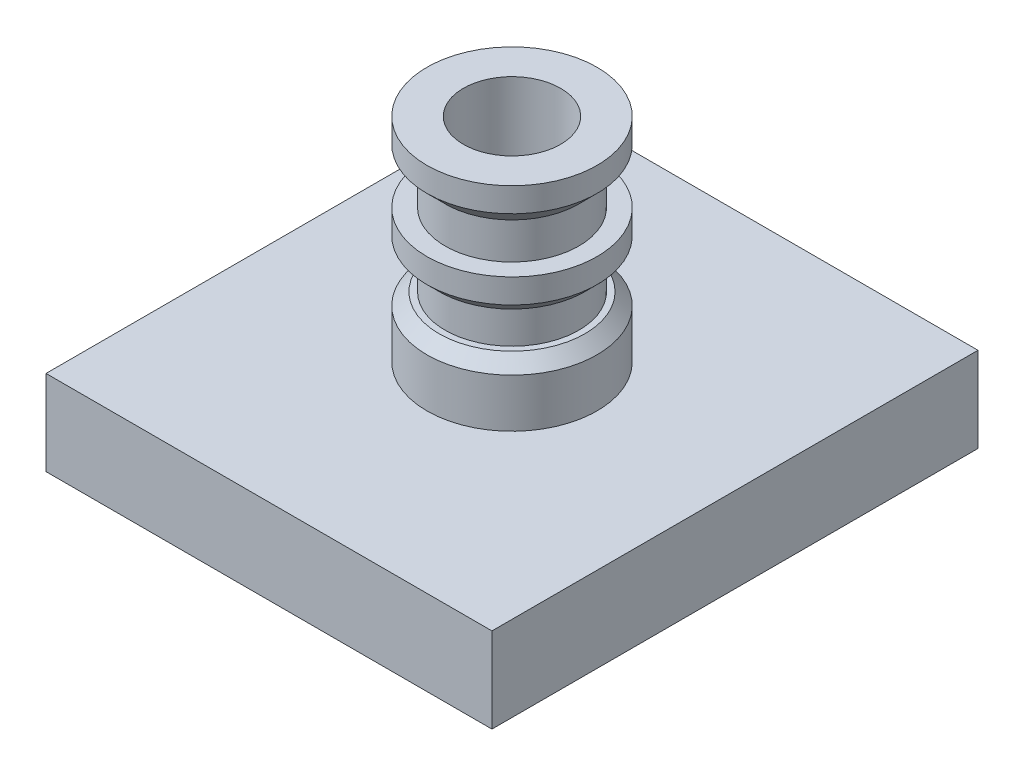
ISO-10303-21;
HEADER;
FILE_DESCRIPTION(('STEP AP214'),'2;1');
FILE_NAME('part.step','',(''),(''),'','','');
FILE_SCHEMA(('AUTOMOTIVE_DESIGN { 1 0 10303 214 1 1 1 1 }'));
ENDSEC;
DATA;
#1=APPLICATION_CONTEXT('core data for automotive mechanical design processes');
#2=APPLICATION_PROTOCOL_DEFINITION('international standard','automotive_design',2000,#1);
#3=PRODUCT_CONTEXT('',#1,'mechanical');
#4=PRODUCT('Part','Part','',(#3));
#5=PRODUCT_RELATED_PRODUCT_CATEGORY('part','',(#4));
#6=PRODUCT_DEFINITION_FORMATION('','',#4);
#7=PRODUCT_DEFINITION_CONTEXT('part definition',#1,'design');
#8=PRODUCT_DEFINITION('design','',#6,#7);
#9=PRODUCT_DEFINITION_SHAPE('','',#8);
#10=(LENGTH_UNIT() NAMED_UNIT(*) SI_UNIT(.MILLI.,.METRE.));
#11=(NAMED_UNIT(*) PLANE_ANGLE_UNIT() SI_UNIT($,.RADIAN.));
#12=(NAMED_UNIT(*) SI_UNIT($,.STERADIAN.) SOLID_ANGLE_UNIT());
#13=UNCERTAINTY_MEASURE_WITH_UNIT(LENGTH_MEASURE(1.E-05),#10,'distance_accuracy_value','');
#14=(GEOMETRIC_REPRESENTATION_CONTEXT(3) GLOBAL_UNCERTAINTY_ASSIGNED_CONTEXT((#13)) GLOBAL_UNIT_ASSIGNED_CONTEXT((#10,
#11,#12)) REPRESENTATION_CONTEXT('',''));
#15=CARTESIAN_POINT('',(0.,0.,0.));
#16=DIRECTION('',(0.,0.,1.));
#17=DIRECTION('',(1.,0.,0.));
#18=AXIS2_PLACEMENT_3D('',#15,#16,#17);
#19=CARTESIAN_POINT('',(0.,7.,0.));
#20=DIRECTION('',(0.,-1.,0.));
#21=DIRECTION('',(0.,0.,-1.));
#22=AXIS2_PLACEMENT_3D('',#19,#20,#21);
#23=CYLINDRICAL_SURFACE('',#22,4.);
#24=CARTESIAN_POINT('',(0.,24.5,0.));
#25=DIRECTION('',(0.,-1.,0.));
#26=DIRECTION('',(0.,0.,-1.));
#27=AXIS2_PLACEMENT_3D('',#24,#25,#26);
#28=CIRCLE('',#27,4.);
#29=CARTESIAN_POINT('',(0.,24.5,-4.));
#30=VERTEX_POINT('',#29);
#31=EDGE_CURVE('E202',#30,#30,#28,.T.);
#32=ORIENTED_EDGE('',*,*,#31,.F.);
#33=EDGE_LOOP('',(#32));
#34=FACE_BOUND('',#33,.T.);
#35=CARTESIAN_POINT('',(0.,2.,0.));
#36=DIRECTION('',(0.,-1.,0.));
#37=DIRECTION('',(0.,0.,-1.));
#38=AXIS2_PLACEMENT_3D('',#35,#36,#37);
#39=CIRCLE('',#38,4.);
#40=CARTESIAN_POINT('',(0.,2.,-4.));
#41=VERTEX_POINT('',#40);
#42=EDGE_CURVE('E40',#41,#41,#39,.T.);
#43=ORIENTED_EDGE('',*,*,#42,.T.);
#44=EDGE_LOOP('',(#43));
#45=FACE_BOUND('',#44,.T.);
#46=ADVANCED_FACE('F35',(#34,#45),#23,.F.);
#47=CARTESIAN_POINT('',(0.,7.,0.));
#48=DIRECTION('',(0.,-1.,0.));
#49=DIRECTION('',(0.,0.,-1.));
#50=AXIS2_PLACEMENT_3D('',#47,#48,#49);
#51=PLANE('',#50);
#52=CARTESIAN_POINT('',(0.,7.,0.));
#53=DIRECTION('',(0.,-1.,0.));
#54=DIRECTION('',(0.,0.,-1.));
#55=AXIS2_PLACEMENT_3D('',#52,#53,#54);
#56=CIRCLE('',#55,7.);
#57=CARTESIAN_POINT('',(0.,7.,-7.));
#58=VERTEX_POINT('',#57);
#59=EDGE_CURVE('E108',#58,#58,#56,.T.);
#60=ORIENTED_EDGE('',*,*,#59,.T.);
#61=EDGE_LOOP('',(#60));
#62=FACE_BOUND('',#61,.T.);
#63=DIRECTION('',(0.,0.,-1.));
#64=VECTOR('',#63,1.);
#65=CARTESIAN_POINT('',(18.35,7.,20.));
#66=LINE('',#65,#64);
#67=CARTESIAN_POINT('',(18.35,7.,20.));
#68=VERTEX_POINT('',#67);
#69=CARTESIAN_POINT('',(18.35,7.,-20.));
#70=VERTEX_POINT('',#69);
#71=EDGE_CURVE('E90',#68,#70,#66,.T.);
#72=ORIENTED_EDGE('',*,*,#71,.T.);
#73=DIRECTION('',(-1.,0.,0.));
#74=VECTOR('',#73,1.);
#75=CARTESIAN_POINT('',(-18.35,7.,-20.));
#76=LINE('',#75,#74);
#77=CARTESIAN_POINT('',(-18.35,7.,-20.));
#78=VERTEX_POINT('',#77);
#79=EDGE_CURVE('E85',#70,#78,#76,.T.);
#80=ORIENTED_EDGE('',*,*,#79,.T.);
#81=DIRECTION('',(0.,0.,1.));
#82=VECTOR('',#81,1.);
#83=CARTESIAN_POINT('',(-18.35,7.,20.));
#84=LINE('',#83,#82);
#85=CARTESIAN_POINT('',(-18.35,7.,20.));
#86=VERTEX_POINT('',#85);
#87=EDGE_CURVE('E88',#78,#86,#84,.T.);
#88=ORIENTED_EDGE('',*,*,#87,.T.);
#89=DIRECTION('',(1.,0.,0.));
#90=VECTOR('',#89,1.);
#91=CARTESIAN_POINT('',(-18.35,7.,20.));
#92=LINE('',#91,#90);
#93=EDGE_CURVE('E54',#86,#68,#92,.T.);
#94=ORIENTED_EDGE('',*,*,#93,.T.);
#95=EDGE_LOOP('',(#72,#80,#88,#94));
#96=FACE_BOUND('',#95,.T.);
#97=ADVANCED_FACE('F86',(#62,#96),#51,.F.);
#98=CARTESIAN_POINT('',(0.,0.,0.));
#99=DIRECTION('',(0.,-1.,0.));
#100=DIRECTION('',(0.,0.,-1.));
#101=AXIS2_PLACEMENT_3D('',#98,#99,#100);
#102=PLANE('',#101);
#103=CARTESIAN_POINT('',(0.,0.,0.));
#104=DIRECTION('',(0.,-1.,0.));
#105=DIRECTION('',(0.,0.,-1.));
#106=AXIS2_PLACEMENT_3D('',#103,#104,#105);
#107=CIRCLE('',#106,6.55);
#108=CARTESIAN_POINT('',(0.,0.,-6.55));
#109=VERTEX_POINT('',#108);
#110=EDGE_CURVE('E205',#109,#109,#107,.T.);
#111=ORIENTED_EDGE('',*,*,#110,.F.);
#112=EDGE_LOOP('',(#111));
#113=FACE_BOUND('',#112,.T.);
#114=DIRECTION('',(0.,0.,-1.));
#115=VECTOR('',#114,1.);
#116=CARTESIAN_POINT('',(18.35,0.,20.));
#117=LINE('',#116,#115);
#118=CARTESIAN_POINT('',(18.35,0.,20.));
#119=VERTEX_POINT('',#118);
#120=CARTESIAN_POINT('',(18.35,0.,-20.));
#121=VERTEX_POINT('',#120);
#122=EDGE_CURVE('E105',#119,#121,#117,.T.);
#123=ORIENTED_EDGE('',*,*,#122,.F.);
#124=DIRECTION('',(1.,0.,0.));
#125=VECTOR('',#124,1.);
#126=CARTESIAN_POINT('',(-18.35,0.,20.));
#127=LINE('',#126,#125);
#128=CARTESIAN_POINT('',(-18.35,0.,20.));
#129=VERTEX_POINT('',#128);
#130=EDGE_CURVE('E77',#129,#119,#127,.T.);
#131=ORIENTED_EDGE('',*,*,#130,.F.);
#132=DIRECTION('',(0.,0.,1.));
#133=VECTOR('',#132,1.);
#134=CARTESIAN_POINT('',(-18.35,0.,20.));
#135=LINE('',#134,#133);
#136=CARTESIAN_POINT('',(-18.35,0.,-20.));
#137=VERTEX_POINT('',#136);
#138=EDGE_CURVE('E71',#137,#129,#135,.T.);
#139=ORIENTED_EDGE('',*,*,#138,.F.);
#140=DIRECTION('',(-1.,0.,0.));
#141=VECTOR('',#140,1.);
#142=CARTESIAN_POINT('',(-18.35,0.,-20.));
#143=LINE('',#142,#141);
#144=EDGE_CURVE('E95',#121,#137,#143,.T.);
#145=ORIENTED_EDGE('',*,*,#144,.F.);
#146=EDGE_LOOP('',(#123,#131,#139,#145));
#147=FACE_BOUND('',#146,.T.);
#148=ADVANCED_FACE('F147',(#113,#147),#102,.T.);
#149=CARTESIAN_POINT('',(18.35,7.,20.));
#150=DIRECTION('',(-1.,0.,0.));
#151=DIRECTION('',(0.,0.,1.));
#152=AXIS2_PLACEMENT_3D('',#149,#150,#151);
#153=PLANE('',#152);
#154=ORIENTED_EDGE('',*,*,#122,.T.);
#155=DIRECTION('',(0.,-1.,0.));
#156=VECTOR('',#155,1.);
#157=CARTESIAN_POINT('',(18.35,7.,-20.));
#158=LINE('',#157,#156);
#159=EDGE_CURVE('E96',#70,#121,#158,.T.);
#160=ORIENTED_EDGE('',*,*,#159,.F.);
#161=ORIENTED_EDGE('',*,*,#71,.F.);
#162=DIRECTION('',(0.,-1.,0.));
#163=VECTOR('',#162,1.);
#164=CARTESIAN_POINT('',(18.35,7.,20.));
#165=LINE('',#164,#163);
#166=EDGE_CURVE('E101',#68,#119,#165,.T.);
#167=ORIENTED_EDGE('',*,*,#166,.T.);
#168=EDGE_LOOP('',(#154,#160,#161,#167));
#169=FACE_BOUND('',#168,.T.);
#170=ADVANCED_FACE('F158',(#169),#153,.F.);
#171=CARTESIAN_POINT('',(-18.35,7.,-20.));
#172=DIRECTION('',(0.,0.,1.));
#173=DIRECTION('',(1.,0.,0.));
#174=AXIS2_PLACEMENT_3D('',#171,#172,#173);
#175=PLANE('',#174);
#176=ORIENTED_EDGE('',*,*,#144,.T.);
#177=DIRECTION('',(0.,-1.,0.));
#178=VECTOR('',#177,1.);
#179=CARTESIAN_POINT('',(-18.35,7.,-20.));
#180=LINE('',#179,#178);
#181=EDGE_CURVE('E93',#78,#137,#180,.T.);
#182=ORIENTED_EDGE('',*,*,#181,.F.);
#183=ORIENTED_EDGE('',*,*,#79,.F.);
#184=ORIENTED_EDGE('',*,*,#159,.T.);
#185=EDGE_LOOP('',(#176,#182,#183,#184));
#186=FACE_BOUND('',#185,.T.);
#187=ADVANCED_FACE('F94',(#186),#175,.F.);
#188=CARTESIAN_POINT('',(-18.35,7.,20.));
#189=DIRECTION('',(1.,0.,0.));
#190=DIRECTION('',(0.,0.,-1.));
#191=AXIS2_PLACEMENT_3D('',#188,#189,#190);
#192=PLANE('',#191);
#193=ORIENTED_EDGE('',*,*,#138,.T.);
#194=DIRECTION('',(0.,-1.,0.));
#195=VECTOR('',#194,1.);
#196=CARTESIAN_POINT('',(-18.35,7.,20.));
#197=LINE('',#196,#195);
#198=EDGE_CURVE('E97',#86,#129,#197,.T.);
#199=ORIENTED_EDGE('',*,*,#198,.F.);
#200=ORIENTED_EDGE('',*,*,#87,.F.);
#201=ORIENTED_EDGE('',*,*,#181,.T.);
#202=EDGE_LOOP('',(#193,#199,#200,#201));
#203=FACE_BOUND('',#202,.T.);
#204=ADVANCED_FACE('F99',(#203),#192,.F.);
#205=CARTESIAN_POINT('',(-18.35,7.,20.));
#206=DIRECTION('',(0.,0.,-1.));
#207=DIRECTION('',(-1.,0.,0.));
#208=AXIS2_PLACEMENT_3D('',#205,#206,#207);
#209=PLANE('',#208);
#210=ORIENTED_EDGE('',*,*,#130,.T.);
#211=ORIENTED_EDGE('',*,*,#166,.F.);
#212=ORIENTED_EDGE('',*,*,#93,.F.);
#213=ORIENTED_EDGE('',*,*,#198,.T.);
#214=EDGE_LOOP('',(#210,#211,#212,#213));
#215=FACE_BOUND('',#214,.T.);
#216=ADVANCED_FACE('F160',(#215),#209,.F.);
#217=CARTESIAN_POINT('',(0.,7.,0.));
#218=DIRECTION('',(0.,-1.,0.));
#219=DIRECTION('',(0.,0.,-1.));
#220=AXIS2_PLACEMENT_3D('',#217,#218,#219);
#221=CYLINDRICAL_SURFACE('',#220,7.);
#222=CARTESIAN_POINT('',(0.,11.,0.));
#223=DIRECTION('',(0.,1.,0.));
#224=DIRECTION('',(0.,0.,1.));
#225=AXIS2_PLACEMENT_3D('',#222,#223,#224);
#226=CIRCLE('',#225,7.);
#227=CARTESIAN_POINT('',(0.,11.,7.));
#228=VERTEX_POINT('',#227);
#229=EDGE_CURVE('E115',#228,#228,#226,.F.);
#230=ORIENTED_EDGE('',*,*,#229,.T.);
#231=EDGE_LOOP('',(#230));
#232=FACE_BOUND('',#231,.T.);
#233=ORIENTED_EDGE('',*,*,#59,.F.);
#234=EDGE_LOOP('',(#233));
#235=FACE_BOUND('',#234,.T.);
#236=ADVANCED_FACE('F153',(#232,#235),#221,.T.);
#237=CARTESIAN_POINT('',(0.,12.,-7.));
#238=DIRECTION('',(0.,1.,0.));
#239=DIRECTION('',(0.,0.,1.));
#240=AXIS2_PLACEMENT_3D('',#237,#238,#239);
#241=PLANE('',#240);
#242=CARTESIAN_POINT('',(0.,12.,0.));
#243=DIRECTION('',(0.,1.,0.));
#244=DIRECTION('',(0.,0.,1.));
#245=AXIS2_PLACEMENT_3D('',#242,#243,#244);
#246=CIRCLE('',#245,5.99999999999998);
#247=CARTESIAN_POINT('',(0.,12.,5.99999999999998));
#248=VERTEX_POINT('',#247);
#249=EDGE_CURVE('E118',#248,#248,#246,.T.);
#250=ORIENTED_EDGE('',*,*,#249,.T.);
#251=EDGE_LOOP('',(#250));
#252=FACE_BOUND('',#251,.T.);
#253=CARTESIAN_POINT('',(0.,12.,0.));
#254=DIRECTION('',(0.,-1.,0.));
#255=DIRECTION('',(0.,0.,-1.));
#256=AXIS2_PLACEMENT_3D('',#253,#254,#255);
#257=CIRCLE('',#256,5.5);
#258=CARTESIAN_POINT('',(0.,12.,-5.5));
#259=VERTEX_POINT('',#258);
#260=EDGE_CURVE('E181',#259,#259,#257,.T.);
#261=ORIENTED_EDGE('',*,*,#260,.T.);
#262=EDGE_LOOP('',(#261));
#263=FACE_BOUND('',#262,.T.);
#264=ADVANCED_FACE('F247',(#252,#263),#241,.T.);
#265=CARTESIAN_POINT('',(0.,7.,0.));
#266=DIRECTION('',(0.,-1.,0.));
#267=DIRECTION('',(0.,0.,-1.));
#268=AXIS2_PLACEMENT_3D('',#265,#266,#267);
#269=CYLINDRICAL_SURFACE('',#268,5.5);
#270=CARTESIAN_POINT('',(0.,15.,0.));
#271=DIRECTION('',(0.,-1.,0.));
#272=DIRECTION('',(0.,0.,-1.));
#273=AXIS2_PLACEMENT_3D('',#270,#271,#272);
#274=CIRCLE('',#273,5.5);
#275=CARTESIAN_POINT('',(0.,15.,-5.5));
#276=VERTEX_POINT('',#275);
#277=EDGE_CURVE('E184',#276,#276,#274,.T.);
#278=ORIENTED_EDGE('',*,*,#277,.T.);
#279=EDGE_LOOP('',(#278));
#280=FACE_BOUND('',#279,.T.);
#281=ORIENTED_EDGE('',*,*,#260,.F.);
#282=EDGE_LOOP('',(#281));
#283=FACE_BOUND('',#282,.T.);
#284=ADVANCED_FACE('F245',(#280,#283),#269,.T.);
#285=CARTESIAN_POINT('',(0.,15.,-5.5));
#286=DIRECTION('',(0.,-1.,0.));
#287=DIRECTION('',(0.,0.,-1.));
#288=AXIS2_PLACEMENT_3D('',#285,#286,#287);
#289=PLANE('',#288);
#290=CARTESIAN_POINT('',(0.,15.,0.));
#291=DIRECTION('',(0.,-1.,0.));
#292=DIRECTION('',(0.,0.,-1.));
#293=AXIS2_PLACEMENT_3D('',#290,#291,#292);
#294=CIRCLE('',#293,6.00000000000001);
#295=CARTESIAN_POINT('',(0.,15.,-6.00000000000001));
#296=VERTEX_POINT('',#295);
#297=EDGE_CURVE('E46',#296,#296,#294,.T.);
#298=ORIENTED_EDGE('',*,*,#297,.T.);
#299=EDGE_LOOP('',(#298));
#300=FACE_BOUND('',#299,.T.);
#301=ORIENTED_EDGE('',*,*,#277,.F.);
#302=EDGE_LOOP('',(#301));
#303=FACE_BOUND('',#302,.T.);
#304=ADVANCED_FACE('F124',(#300,#303),#289,.T.);
#305=CARTESIAN_POINT('',(0.,7.,0.));
#306=DIRECTION('',(0.,-1.,0.));
#307=DIRECTION('',(0.,0.,-1.));
#308=AXIS2_PLACEMENT_3D('',#305,#306,#307);
#309=CYLINDRICAL_SURFACE('',#308,7.);
#310=CARTESIAN_POINT('',(0.,16.,0.));
#311=DIRECTION('',(0.,-1.,0.));
#312=DIRECTION('',(0.,0.,-1.));
#313=AXIS2_PLACEMENT_3D('',#310,#311,#312);
#314=CIRCLE('',#313,7.);
#315=CARTESIAN_POINT('',(0.,16.,-7.));
#316=VERTEX_POINT('',#315);
#317=EDGE_CURVE('E11',#316,#316,#314,.F.);
#318=ORIENTED_EDGE('',*,*,#317,.T.);
#319=EDGE_LOOP('',(#318));
#320=FACE_BOUND('',#319,.T.);
#321=CARTESIAN_POINT('',(0.,18.,0.));
#322=DIRECTION('',(0.,-1.,0.));
#323=DIRECTION('',(0.,0.,-1.));
#324=AXIS2_PLACEMENT_3D('',#321,#322,#323);
#325=CIRCLE('',#324,7.);
#326=CARTESIAN_POINT('',(0.,18.,-7.));
#327=VERTEX_POINT('',#326);
#328=EDGE_CURVE('E187',#327,#327,#325,.T.);
#329=ORIENTED_EDGE('',*,*,#328,.T.);
#330=EDGE_LOOP('',(#329));
#331=FACE_BOUND('',#330,.T.);
#332=ADVANCED_FACE('F238',(#320,#331),#309,.T.);
#333=CARTESIAN_POINT('',(0.,18.,-7.));
#334=DIRECTION('',(0.,1.,0.));
#335=DIRECTION('',(0.,0.,1.));
#336=AXIS2_PLACEMENT_3D('',#333,#334,#335);
#337=PLANE('',#336);
#338=CARTESIAN_POINT('',(0.,18.,0.));
#339=DIRECTION('',(0.,-1.,0.));
#340=DIRECTION('',(0.,0.,-1.));
#341=AXIS2_PLACEMENT_3D('',#338,#339,#340);
#342=CIRCLE('',#341,5.5);
#343=CARTESIAN_POINT('',(0.,18.,-5.5));
#344=VERTEX_POINT('',#343);
#345=EDGE_CURVE('E190',#344,#344,#342,.T.);
#346=ORIENTED_EDGE('',*,*,#345,.T.);
#347=EDGE_LOOP('',(#346));
#348=FACE_BOUND('',#347,.T.);
#349=ORIENTED_EDGE('',*,*,#328,.F.);
#350=EDGE_LOOP('',(#349));
#351=FACE_BOUND('',#350,.T.);
#352=ADVANCED_FACE('F234',(#348,#351),#337,.T.);
#353=CARTESIAN_POINT('',(0.,7.,0.));
#354=DIRECTION('',(0.,-1.,0.));
#355=DIRECTION('',(0.,0.,-1.));
#356=AXIS2_PLACEMENT_3D('',#353,#354,#355);
#357=CYLINDRICAL_SURFACE('',#356,5.5);
#358=CARTESIAN_POINT('',(0.,21.,0.));
#359=DIRECTION('',(0.,-1.,0.));
#360=DIRECTION('',(0.,0.,-1.));
#361=AXIS2_PLACEMENT_3D('',#358,#359,#360);
#362=CIRCLE('',#361,5.5);
#363=CARTESIAN_POINT('',(0.,21.,-5.5));
#364=VERTEX_POINT('',#363);
#365=EDGE_CURVE('E193',#364,#364,#362,.T.);
#366=ORIENTED_EDGE('',*,*,#365,.T.);
#367=EDGE_LOOP('',(#366));
#368=FACE_BOUND('',#367,.T.);
#369=ORIENTED_EDGE('',*,*,#345,.F.);
#370=EDGE_LOOP('',(#369));
#371=FACE_BOUND('',#370,.T.);
#372=ADVANCED_FACE('F230',(#368,#371),#357,.T.);
#373=CARTESIAN_POINT('',(0.,21.,0.));
#374=DIRECTION('',(0.,1.,0.));
#375=DIRECTION('',(0.,0.,1.));
#376=AXIS2_PLACEMENT_3D('',#373,#374,#375);
#377=CONICAL_SURFACE('',#376,5.5,0.785398163397447);
#378=CARTESIAN_POINT('',(0.,22.5,0.));
#379=DIRECTION('',(0.,-1.,0.));
#380=DIRECTION('',(0.,0.,-1.));
#381=AXIS2_PLACEMENT_3D('',#378,#379,#380);
#382=CIRCLE('',#381,7.);
#383=CARTESIAN_POINT('',(0.,22.5,-7.));
#384=VERTEX_POINT('',#383);
#385=EDGE_CURVE('E196',#384,#384,#382,.T.);
#386=ORIENTED_EDGE('',*,*,#385,.T.);
#387=EDGE_LOOP('',(#386));
#388=FACE_BOUND('',#387,.T.);
#389=ORIENTED_EDGE('',*,*,#365,.F.);
#390=EDGE_LOOP('',(#389));
#391=FACE_BOUND('',#390,.T.);
#392=ADVANCED_FACE('F226',(#388,#391),#377,.T.);
#393=CARTESIAN_POINT('',(0.,7.,0.));
#394=DIRECTION('',(0.,-1.,0.));
#395=DIRECTION('',(0.,0.,-1.));
#396=AXIS2_PLACEMENT_3D('',#393,#394,#395);
#397=CYLINDRICAL_SURFACE('',#396,7.);
#398=CARTESIAN_POINT('',(0.,24.5,0.));
#399=DIRECTION('',(0.,-1.,0.));
#400=DIRECTION('',(0.,0.,-1.));
#401=AXIS2_PLACEMENT_3D('',#398,#399,#400);
#402=CIRCLE('',#401,7.);
#403=CARTESIAN_POINT('',(0.,24.5,-7.));
#404=VERTEX_POINT('',#403);
#405=EDGE_CURVE('E199',#404,#404,#402,.T.);
#406=ORIENTED_EDGE('',*,*,#405,.T.);
#407=EDGE_LOOP('',(#406));
#408=FACE_BOUND('',#407,.T.);
#409=ORIENTED_EDGE('',*,*,#385,.F.);
#410=EDGE_LOOP('',(#409));
#411=FACE_BOUND('',#410,.T.);
#412=ADVANCED_FACE('F222',(#408,#411),#397,.T.);
#413=CARTESIAN_POINT('',(0.,24.5,-7.));
#414=DIRECTION('',(0.,1.,0.));
#415=DIRECTION('',(0.,0.,1.));
#416=AXIS2_PLACEMENT_3D('',#413,#414,#415);
#417=PLANE('',#416);
#418=ORIENTED_EDGE('',*,*,#31,.T.);
#419=EDGE_LOOP('',(#418));
#420=FACE_BOUND('',#419,.T.);
#421=ORIENTED_EDGE('',*,*,#405,.F.);
#422=EDGE_LOOP('',(#421));
#423=FACE_BOUND('',#422,.T.);
#424=ADVANCED_FACE('F138',(#420,#423),#417,.T.);
#425=CARTESIAN_POINT('',(0.,11.,0.));
#426=DIRECTION('',(0.,-1.,0.));
#427=DIRECTION('',(0.,0.,-1.));
#428=AXIS2_PLACEMENT_3D('',#425,#426,#427);
#429=CONICAL_SURFACE('',#428,7.,0.78539816339745);
#430=ORIENTED_EDGE('',*,*,#249,.F.);
#431=EDGE_LOOP('',(#430));
#432=FACE_BOUND('',#431,.T.);
#433=ORIENTED_EDGE('',*,*,#229,.F.);
#434=EDGE_LOOP('',(#433));
#435=FACE_BOUND('',#434,.T.);
#436=ADVANCED_FACE('F129',(#432,#435),#429,.T.);
#437=CARTESIAN_POINT('',(0.,15.,0.));
#438=DIRECTION('',(0.,1.,0.));
#439=DIRECTION('',(0.,0.,1.));
#440=AXIS2_PLACEMENT_3D('',#437,#438,#439);
#441=CONICAL_SURFACE('',#440,6.00000000000001,0.785398163397444);
#442=ORIENTED_EDGE('',*,*,#317,.F.);
#443=EDGE_LOOP('',(#442));
#444=FACE_BOUND('',#443,.T.);
#445=ORIENTED_EDGE('',*,*,#297,.F.);
#446=EDGE_LOOP('',(#445));
#447=FACE_BOUND('',#446,.T.);
#448=ADVANCED_FACE('F38',(#444,#447),#441,.T.);
#449=CARTESIAN_POINT('',(0.,2.,0.));
#450=DIRECTION('',(0.,-1.,0.));
#451=DIRECTION('',(0.,0.,-1.));
#452=AXIS2_PLACEMENT_3D('',#449,#450,#451);
#453=CYLINDRICAL_SURFACE('',#452,6.55);
#454=CARTESIAN_POINT('',(0.,2.,0.));
#455=DIRECTION('',(0.,-1.,0.));
#456=DIRECTION('',(0.,0.,-1.));
#457=AXIS2_PLACEMENT_3D('',#454,#455,#456);
#458=CIRCLE('',#457,6.55);
#459=CARTESIAN_POINT('',(0.,2.,-6.55));
#460=VERTEX_POINT('',#459);
#461=EDGE_CURVE('E208',#460,#460,#458,.T.);
#462=ORIENTED_EDGE('',*,*,#461,.F.);
#463=EDGE_LOOP('',(#462));
#464=FACE_BOUND('',#463,.T.);
#465=ORIENTED_EDGE('',*,*,#110,.T.);
#466=EDGE_LOOP('',(#465));
#467=FACE_BOUND('',#466,.T.);
#468=ADVANCED_FACE('F128',(#464,#467),#453,.F.);
#469=CARTESIAN_POINT('',(0.,2.,0.));
#470=DIRECTION('',(0.,-1.,0.));
#471=DIRECTION('',(0.,0.,-1.));
#472=AXIS2_PLACEMENT_3D('',#469,#470,#471);
#473=PLANE('',#472);
#474=ORIENTED_EDGE('',*,*,#42,.F.);
#475=EDGE_LOOP('',(#474));
#476=FACE_BOUND('',#475,.T.);
#477=ORIENTED_EDGE('',*,*,#461,.T.);
#478=EDGE_LOOP('',(#477));
#479=FACE_BOUND('',#478,.T.);
#480=ADVANCED_FACE('F135',(#476,#479),#473,.T.);
#481=CLOSED_SHELL('',(#46,#97,#148,#170,#187,#204,#216,#236,#264,#284,#304,#332,#352,#372,#392,
#412,#424,#436,#448,#468,#480));
#482=MANIFOLD_SOLID_BREP('B2',#481);
#483=ADVANCED_BREP_SHAPE_REPRESENTATION('',(#18,#482),#14);
#484=SHAPE_DEFINITION_REPRESENTATION(#9,#483);
ENDSEC;
END-ISO-10303-21;
